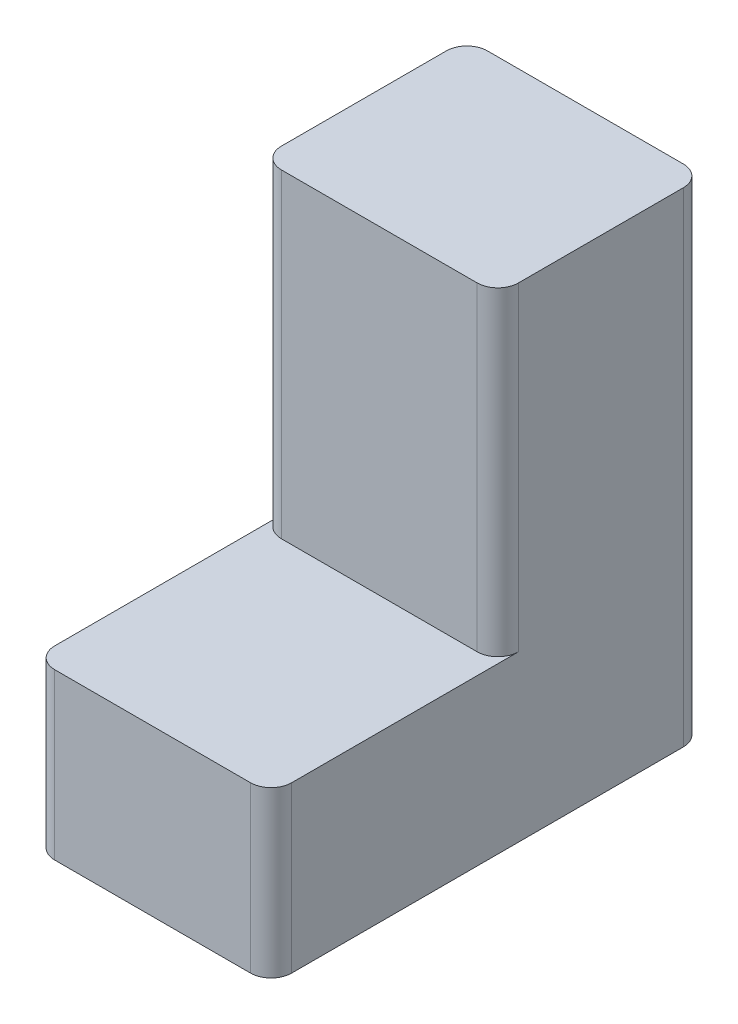
ISO-10303-21;
HEADER;
FILE_DESCRIPTION(('STEP AP214'),'2;1');
FILE_NAME('part.step','',(''),(''),'','','');
FILE_SCHEMA(('AUTOMOTIVE_DESIGN { 1 0 10303 214 1 1 1 1 }'));
ENDSEC;
DATA;
#1=APPLICATION_CONTEXT('core data for automotive mechanical design processes');
#2=APPLICATION_PROTOCOL_DEFINITION('international standard','automotive_design',2000,#1);
#3=PRODUCT_CONTEXT('',#1,'mechanical');
#4=PRODUCT('Part','Part','',(#3));
#5=PRODUCT_RELATED_PRODUCT_CATEGORY('part','',(#4));
#6=PRODUCT_DEFINITION_FORMATION('','',#4);
#7=PRODUCT_DEFINITION_CONTEXT('part definition',#1,'design');
#8=PRODUCT_DEFINITION('design','',#6,#7);
#9=PRODUCT_DEFINITION_SHAPE('','',#8);
#10=(LENGTH_UNIT() NAMED_UNIT(*) SI_UNIT(.MILLI.,.METRE.));
#11=(NAMED_UNIT(*) PLANE_ANGLE_UNIT() SI_UNIT($,.RADIAN.));
#12=(NAMED_UNIT(*) SI_UNIT($,.STERADIAN.) SOLID_ANGLE_UNIT());
#13=UNCERTAINTY_MEASURE_WITH_UNIT(LENGTH_MEASURE(1.E-05),#10,'distance_accuracy_value','');
#14=(GEOMETRIC_REPRESENTATION_CONTEXT(3) GLOBAL_UNCERTAINTY_ASSIGNED_CONTEXT((#13)) GLOBAL_UNIT_ASSIGNED_CONTEXT((#10,
#11,#12)) REPRESENTATION_CONTEXT('',''));
#15=CARTESIAN_POINT('',(0.,0.,0.));
#16=DIRECTION('',(0.,0.,1.));
#17=DIRECTION('',(1.,0.,0.));
#18=AXIS2_PLACEMENT_3D('',#15,#16,#17);
#19=CARTESIAN_POINT('',(11.5,-6.,-10.5));
#20=DIRECTION('',(0.,1.,0.));
#21=DIRECTION('',(0.,0.,1.));
#22=AXIS2_PLACEMENT_3D('',#19,#20,#21);
#23=CYLINDRICAL_SURFACE('',#22,3.5);
#24=DIRECTION('',(0.,-1.,0.));
#25=VECTOR('',#24,1.);
#26=CARTESIAN_POINT('',(9.05051025721682,0.,-13.));
#27=LINE('',#26,#25);
#28=CARTESIAN_POINT('',(9.05051025721682,0.,-13.));
#29=VERTEX_POINT('',#28);
#30=CARTESIAN_POINT('',(9.05051025721682,-6.,-13.));
#31=VERTEX_POINT('',#30);
#32=EDGE_CURVE('E146',#29,#31,#27,.T.);
#33=ORIENTED_EDGE('',*,*,#32,.T.);
#34=CARTESIAN_POINT('',(11.5,-6.,-10.5));
#35=DIRECTION('',(0.,-1.,0.));
#36=DIRECTION('',(0.,0.,-1.));
#37=AXIS2_PLACEMENT_3D('',#34,#35,#36);
#38=CIRCLE('',#37,3.5);
#39=CARTESIAN_POINT('',(9.05051025721682,-6.,-8.));
#40=VERTEX_POINT('',#39);
#41=EDGE_CURVE('E161',#40,#31,#38,.T.);
#42=ORIENTED_EDGE('',*,*,#41,.F.);
#43=DIRECTION('',(0.,-1.,0.));
#44=VECTOR('',#43,1.);
#45=CARTESIAN_POINT('',(9.05051025721682,0.,-8.));
#46=LINE('',#45,#44);
#47=CARTESIAN_POINT('',(9.05051025721682,0.,-8.));
#48=VERTEX_POINT('',#47);
#49=EDGE_CURVE('E48',#48,#40,#46,.T.);
#50=ORIENTED_EDGE('',*,*,#49,.F.);
#51=CARTESIAN_POINT('',(11.5,0.,-10.5));
#52=DIRECTION('',(0.,1.,0.));
#53=DIRECTION('',(0.,0.,1.));
#54=AXIS2_PLACEMENT_3D('',#51,#52,#53);
#55=CIRCLE('',#54,3.5);
#56=EDGE_CURVE('E167',#48,#29,#55,.F.);
#57=ORIENTED_EDGE('',*,*,#56,.T.);
#58=EDGE_LOOP('',(#33,#42,#50,#57));
#59=FACE_BOUND('',#58,.T.);
#60=ADVANCED_FACE('F33',(#59),#23,.T.);
#61=DIRECTION('',(0.,-1.,0.));
#62=VECTOR('',#61,1.);
#63=CARTESIAN_POINT('',(13.9494897427832,0.,-13.));
#64=LINE('',#63,#62);
#65=CARTESIAN_POINT('',(13.9494897427832,0.,-13.));
#66=VERTEX_POINT('',#65);
#67=CARTESIAN_POINT('',(13.9494897427832,-6.,-13.));
#68=VERTEX_POINT('',#67);
#69=EDGE_CURVE('E56',#66,#68,#64,.T.);
#70=ORIENTED_EDGE('',*,*,#69,.F.);
#71=CARTESIAN_POINT('',(13.9494897427832,0.,-8.));
#72=VERTEX_POINT('',#71);
#73=EDGE_CURVE('E158',#66,#72,#55,.F.);
#74=ORIENTED_EDGE('',*,*,#73,.T.);
#75=DIRECTION('',(0.,-1.,0.));
#76=VECTOR('',#75,1.);
#77=CARTESIAN_POINT('',(13.9494897427832,0.,-8.));
#78=LINE('',#77,#76);
#79=CARTESIAN_POINT('',(13.9494897427832,-6.,-8.));
#80=VERTEX_POINT('',#79);
#81=EDGE_CURVE('E458',#72,#80,#78,.T.);
#82=ORIENTED_EDGE('',*,*,#81,.T.);
#83=EDGE_CURVE('E160',#68,#80,#38,.T.);
#84=ORIENTED_EDGE('',*,*,#83,.F.);
#85=EDGE_LOOP('',(#70,#74,#82,#84));
#86=FACE_BOUND('',#85,.T.);
#87=ADVANCED_FACE('F156',(#86),#23,.T.);
#88=CARTESIAN_POINT('',(11.5,-6.,-10.5));
#89=DIRECTION('',(0.,-1.,0.));
#90=DIRECTION('',(0.,0.,-1.));
#91=AXIS2_PLACEMENT_3D('',#88,#89,#90);
#92=PLANE('',#91);
#93=ORIENTED_EDGE('',*,*,#41,.T.);
#94=DIRECTION('',(1.,0.,0.));
#95=VECTOR('',#94,1.);
#96=CARTESIAN_POINT('',(9.05051025721682,-6.,-13.));
#97=LINE('',#96,#95);
#98=EDGE_CURVE('E151',#31,#68,#97,.T.);
#99=ORIENTED_EDGE('',*,*,#98,.T.);
#100=ORIENTED_EDGE('',*,*,#83,.T.);
#101=DIRECTION('',(1.,0.,0.));
#102=VECTOR('',#101,1.);
#103=CARTESIAN_POINT('',(9.05051025721682,-6.,-8.));
#104=LINE('',#103,#102);
#105=EDGE_CURVE('E457',#40,#80,#104,.T.);
#106=ORIENTED_EDGE('',*,*,#105,.F.);
#107=EDGE_LOOP('',(#93,#99,#100,#106));
#108=FACE_BOUND('',#107,.T.);
#109=ADVANCED_FACE('F325',(#108),#92,.T.);
#110=CARTESIAN_POINT('',(23.,0.,-42.));
#111=DIRECTION('',(0.,1.,0.));
#112=DIRECTION('',(0.,0.,1.));
#113=AXIS2_PLACEMENT_3D('',#110,#111,#112);
#114=PLANE('',#113);
#115=ORIENTED_EDGE('',*,*,#56,.F.);
#116=DIRECTION('',(1.,0.,0.));
#117=VECTOR('',#116,1.);
#118=CARTESIAN_POINT('',(9.05051025721682,0.,-8.));
#119=LINE('',#118,#117);
#120=EDGE_CURVE('E166',#48,#72,#119,.T.);
#121=ORIENTED_EDGE('',*,*,#120,.T.);
#122=ORIENTED_EDGE('',*,*,#73,.F.);
#123=DIRECTION('',(1.,0.,0.));
#124=VECTOR('',#123,1.);
#125=CARTESIAN_POINT('',(9.05051025721682,0.,-13.));
#126=LINE('',#125,#124);
#127=EDGE_CURVE('E143',#29,#66,#126,.T.);
#128=ORIENTED_EDGE('',*,*,#127,.F.);
#129=EDGE_LOOP('',(#115,#121,#122,#128));
#130=FACE_BOUND('',#129,.T.);
#131=DIRECTION('',(0.,0.,-1.));
#132=VECTOR('',#131,1.);
#133=CARTESIAN_POINT('',(0.,0.,-42.));
#134=LINE('',#133,#132);
#135=CARTESIAN_POINT('',(0.,0.,-2.00000000000002));
#136=VERTEX_POINT('',#135);
#137=CARTESIAN_POINT('',(0.,0.,-40.));
#138=VERTEX_POINT('',#137);
#139=EDGE_CURVE('E285',#136,#138,#134,.T.);
#140=ORIENTED_EDGE('',*,*,#139,.T.);
#141=CARTESIAN_POINT('',(2.,0.,-40.));
#142=DIRECTION('',(0.,1.,0.));
#143=DIRECTION('',(0.,0.,1.));
#144=AXIS2_PLACEMENT_3D('',#141,#142,#143);
#145=CIRCLE('',#144,2.);
#146=CARTESIAN_POINT('',(2.,0.,-42.));
#147=VERTEX_POINT('',#146);
#148=EDGE_CURVE('E209',#138,#147,#145,.F.);
#149=ORIENTED_EDGE('',*,*,#148,.T.);
#150=DIRECTION('',(-1.,0.,0.));
#151=VECTOR('',#150,1.);
#152=CARTESIAN_POINT('',(23.,0.,-42.));
#153=LINE('',#152,#151);
#154=CARTESIAN_POINT('',(21.,0.,-42.));
#155=VERTEX_POINT('',#154);
#156=EDGE_CURVE('E168',#155,#147,#153,.T.);
#157=ORIENTED_EDGE('',*,*,#156,.F.);
#158=CARTESIAN_POINT('',(21.,0.,-40.));
#159=DIRECTION('',(0.,1.,0.));
#160=DIRECTION('',(0.,0.,1.));
#161=AXIS2_PLACEMENT_3D('',#158,#159,#160);
#162=CIRCLE('',#161,2.);
#163=CARTESIAN_POINT('',(23.,0.,-40.));
#164=VERTEX_POINT('',#163);
#165=EDGE_CURVE('E200',#155,#164,#162,.F.);
#166=ORIENTED_EDGE('',*,*,#165,.T.);
#167=DIRECTION('',(0.,0.,-1.));
#168=VECTOR('',#167,1.);
#169=CARTESIAN_POINT('',(23.,0.,-42.));
#170=LINE('',#169,#168);
#171=CARTESIAN_POINT('',(23.,0.,-2.00000000000002));
#172=VERTEX_POINT('',#171);
#173=EDGE_CURVE('E243',#172,#164,#170,.T.);
#174=ORIENTED_EDGE('',*,*,#173,.F.);
#175=CARTESIAN_POINT('',(21.,0.,-2.));
#176=DIRECTION('',(0.,1.,0.));
#177=DIRECTION('',(0.,0.,1.));
#178=AXIS2_PLACEMENT_3D('',#175,#176,#177);
#179=CIRCLE('',#178,2.);
#180=CARTESIAN_POINT('',(21.,0.,0.));
#181=VERTEX_POINT('',#180);
#182=EDGE_CURVE('E178',#172,#181,#179,.F.);
#183=ORIENTED_EDGE('',*,*,#182,.T.);
#184=DIRECTION('',(-1.,0.,0.));
#185=VECTOR('',#184,1.);
#186=CARTESIAN_POINT('',(23.,0.,0.));
#187=LINE('',#186,#185);
#188=CARTESIAN_POINT('',(2.,0.,0.));
#189=VERTEX_POINT('',#188);
#190=EDGE_CURVE('E259',#181,#189,#187,.T.);
#191=ORIENTED_EDGE('',*,*,#190,.T.);
#192=CARTESIAN_POINT('',(2.,0.,-2.));
#193=DIRECTION('',(0.,1.,0.));
#194=DIRECTION('',(0.,0.,1.));
#195=AXIS2_PLACEMENT_3D('',#192,#193,#194);
#196=CIRCLE('',#195,2.);
#197=EDGE_CURVE('E187',#189,#136,#196,.F.);
#198=ORIENTED_EDGE('',*,*,#197,.T.);
#199=EDGE_LOOP('',(#140,#149,#157,#166,#174,#183,#191,#198));
#200=FACE_BOUND('',#199,.T.);
#201=ADVANCED_FACE('F164',(#130,#200),#114,.F.);
#202=CARTESIAN_POINT('',(23.,47.,-42.));
#203=DIRECTION('',(0.,0.,1.));
#204=DIRECTION('',(0.,-1.,0.));
#205=AXIS2_PLACEMENT_3D('',#202,#203,#204);
#206=PLANE('',#205);
#207=ORIENTED_EDGE('',*,*,#156,.T.);
#208=DIRECTION('',(0.,1.,0.));
#209=VECTOR('',#208,1.);
#210=CARTESIAN_POINT('',(2.,47.,-42.));
#211=LINE('',#210,#209);
#212=CARTESIAN_POINT('',(2.,47.,-42.));
#213=VERTEX_POINT('',#212);
#214=EDGE_CURVE('E202',#147,#213,#211,.T.);
#215=ORIENTED_EDGE('',*,*,#214,.T.);
#216=DIRECTION('',(-1.,0.,0.));
#217=VECTOR('',#216,1.);
#218=CARTESIAN_POINT('',(23.,47.,-42.));
#219=LINE('',#218,#217);
#220=CARTESIAN_POINT('',(21.,47.,-42.));
#221=VERTEX_POINT('',#220);
#222=EDGE_CURVE('E172',#221,#213,#219,.T.);
#223=ORIENTED_EDGE('',*,*,#222,.F.);
#224=DIRECTION('',(0.,1.,0.));
#225=VECTOR('',#224,1.);
#226=CARTESIAN_POINT('',(21.,47.,-42.));
#227=LINE('',#226,#225);
#228=EDGE_CURVE('E198',#221,#155,#227,.F.);
#229=ORIENTED_EDGE('',*,*,#228,.T.);
#230=EDGE_LOOP('',(#207,#215,#223,#229));
#231=FACE_BOUND('',#230,.T.);
#232=ADVANCED_FACE('F268',(#231),#206,.F.);
#233=CARTESIAN_POINT('',(23.,47.,-22.));
#234=DIRECTION('',(0.,-1.,0.));
#235=DIRECTION('',(0.,0.,-1.));
#236=AXIS2_PLACEMENT_3D('',#233,#234,#235);
#237=PLANE('',#236);
#238=DIRECTION('',(-1.,0.,0.));
#239=VECTOR('',#238,1.);
#240=CARTESIAN_POINT('',(23.,47.,-22.));
#241=LINE('',#240,#239);
#242=CARTESIAN_POINT('',(21.,47.,-22.));
#243=VERTEX_POINT('',#242);
#244=CARTESIAN_POINT('',(2.,47.,-22.));
#245=VERTEX_POINT('',#244);
#246=EDGE_CURVE('E233',#243,#245,#241,.T.);
#247=ORIENTED_EDGE('',*,*,#246,.F.);
#248=CARTESIAN_POINT('',(21.,47.,-24.));
#249=DIRECTION('',(0.,-1.,0.));
#250=DIRECTION('',(0.,0.,-1.));
#251=AXIS2_PLACEMENT_3D('',#248,#249,#250);
#252=CIRCLE('',#251,2.);
#253=CARTESIAN_POINT('',(23.,47.,-24.));
#254=VERTEX_POINT('',#253);
#255=EDGE_CURVE('E41',#243,#254,#252,.F.);
#256=ORIENTED_EDGE('',*,*,#255,.T.);
#257=DIRECTION('',(0.,0.,1.));
#258=VECTOR('',#257,1.);
#259=CARTESIAN_POINT('',(23.,47.,-22.));
#260=LINE('',#259,#258);
#261=CARTESIAN_POINT('',(23.,47.,-40.));
#262=VERTEX_POINT('',#261);
#263=EDGE_CURVE('E232',#262,#254,#260,.T.);
#264=ORIENTED_EDGE('',*,*,#263,.F.);
#265=CARTESIAN_POINT('',(21.,47.,-40.));
#266=DIRECTION('',(0.,-1.,0.));
#267=DIRECTION('',(0.,0.,-1.));
#268=AXIS2_PLACEMENT_3D('',#265,#266,#267);
#269=CIRCLE('',#268,2.);
#270=EDGE_CURVE('E196',#262,#221,#269,.F.);
#271=ORIENTED_EDGE('',*,*,#270,.T.);
#272=ORIENTED_EDGE('',*,*,#222,.T.);
#273=CARTESIAN_POINT('',(2.,47.,-40.));
#274=DIRECTION('',(0.,-1.,0.));
#275=DIRECTION('',(0.,0.,-1.));
#276=AXIS2_PLACEMENT_3D('',#273,#274,#275);
#277=CIRCLE('',#276,2.);
#278=CARTESIAN_POINT('',(0.,47.,-40.));
#279=VERTEX_POINT('',#278);
#280=EDGE_CURVE('E205',#213,#279,#277,.F.);
#281=ORIENTED_EDGE('',*,*,#280,.T.);
#282=DIRECTION('',(0.,0.,1.));
#283=VECTOR('',#282,1.);
#284=CARTESIAN_POINT('',(0.,47.,-22.));
#285=LINE('',#284,#283);
#286=CARTESIAN_POINT('',(0.,47.,-24.));
#287=VERTEX_POINT('',#286);
#288=EDGE_CURVE('E279',#279,#287,#285,.T.);
#289=ORIENTED_EDGE('',*,*,#288,.T.);
#290=CARTESIAN_POINT('',(2.,47.,-24.));
#291=DIRECTION('',(0.,-1.,0.));
#292=DIRECTION('',(0.,0.,-1.));
#293=AXIS2_PLACEMENT_3D('',#290,#291,#292);
#294=CIRCLE('',#293,2.);
#295=EDGE_CURVE('E216',#287,#245,#294,.F.);
#296=ORIENTED_EDGE('',*,*,#295,.T.);
#297=EDGE_LOOP('',(#247,#256,#264,#271,#272,#281,#289,#296));
#298=FACE_BOUND('',#297,.T.);
#299=ADVANCED_FACE('F231',(#298),#237,.F.);
#300=CARTESIAN_POINT('',(23.,16.,-22.));
#301=DIRECTION('',(0.,0.,-1.));
#302=DIRECTION('',(-1.,0.,0.));
#303=AXIS2_PLACEMENT_3D('',#300,#301,#302);
#304=PLANE('',#303);
#305=DIRECTION('',(-1.,0.,0.));
#306=VECTOR('',#305,1.);
#307=CARTESIAN_POINT('',(23.,16.,-22.));
#308=LINE('',#307,#306);
#309=CARTESIAN_POINT('',(21.,16.,-22.));
#310=VERTEX_POINT('',#309);
#311=CARTESIAN_POINT('',(2.,16.,-22.));
#312=VERTEX_POINT('',#311);
#313=EDGE_CURVE('E250',#310,#312,#308,.T.);
#314=ORIENTED_EDGE('',*,*,#313,.F.);
#315=DIRECTION('',(0.,-1.,0.));
#316=VECTOR('',#315,1.);
#317=CARTESIAN_POINT('',(21.,16.,-22.));
#318=LINE('',#317,#316);
#319=EDGE_CURVE('E225',#310,#243,#318,.F.);
#320=ORIENTED_EDGE('',*,*,#319,.T.);
#321=ORIENTED_EDGE('',*,*,#246,.T.);
#322=DIRECTION('',(0.,-1.,0.));
#323=VECTOR('',#322,1.);
#324=CARTESIAN_POINT('',(2.,16.,-22.));
#325=LINE('',#324,#323);
#326=EDGE_CURVE('E211',#245,#312,#325,.T.);
#327=ORIENTED_EDGE('',*,*,#326,.T.);
#328=EDGE_LOOP('',(#314,#320,#321,#327));
#329=FACE_BOUND('',#328,.T.);
#330=ADVANCED_FACE('F253',(#329),#304,.F.);
#331=CARTESIAN_POINT('',(23.,16.,0.));
#332=DIRECTION('',(0.,-1.,0.));
#333=DIRECTION('',(0.,0.,-1.));
#334=AXIS2_PLACEMENT_3D('',#331,#332,#333);
#335=PLANE('',#334);
#336=DIRECTION('',(0.,0.,1.));
#337=VECTOR('',#336,1.);
#338=CARTESIAN_POINT('',(0.,16.,0.));
#339=LINE('',#338,#337);
#340=CARTESIAN_POINT('',(0.,16.,-24.));
#341=VERTEX_POINT('',#340);
#342=CARTESIAN_POINT('',(0.,16.,-2.));
#343=VERTEX_POINT('',#342);
#344=EDGE_CURVE('E277',#341,#343,#339,.T.);
#345=ORIENTED_EDGE('',*,*,#344,.T.);
#346=CARTESIAN_POINT('',(2.,16.,-2.));
#347=DIRECTION('',(0.,-1.,0.));
#348=DIRECTION('',(0.,0.,-1.));
#349=AXIS2_PLACEMENT_3D('',#346,#347,#348);
#350=CIRCLE('',#349,2.);
#351=CARTESIAN_POINT('',(2.,16.,0.));
#352=VERTEX_POINT('',#351);
#353=EDGE_CURVE('E191',#343,#352,#350,.F.);
#354=ORIENTED_EDGE('',*,*,#353,.T.);
#355=DIRECTION('',(-1.,0.,0.));
#356=VECTOR('',#355,1.);
#357=CARTESIAN_POINT('',(23.,16.,0.));
#358=LINE('',#357,#356);
#359=CARTESIAN_POINT('',(21.,16.,0.));
#360=VERTEX_POINT('',#359);
#361=EDGE_CURVE('E255',#360,#352,#358,.T.);
#362=ORIENTED_EDGE('',*,*,#361,.F.);
#363=CARTESIAN_POINT('',(21.,16.,-2.));
#364=DIRECTION('',(0.,-1.,0.));
#365=DIRECTION('',(0.,0.,-1.));
#366=AXIS2_PLACEMENT_3D('',#363,#364,#365);
#367=CIRCLE('',#366,2.);
#368=CARTESIAN_POINT('',(23.,16.,-2.));
#369=VERTEX_POINT('',#368);
#370=EDGE_CURVE('E182',#360,#369,#367,.F.);
#371=ORIENTED_EDGE('',*,*,#370,.T.);
#372=DIRECTION('',(0.,0.,1.));
#373=VECTOR('',#372,1.);
#374=CARTESIAN_POINT('',(23.,16.,0.));
#375=LINE('',#374,#373);
#376=CARTESIAN_POINT('',(23.,16.,-24.));
#377=VERTEX_POINT('',#376);
#378=EDGE_CURVE('E242',#377,#369,#375,.T.);
#379=ORIENTED_EDGE('',*,*,#378,.F.);
#380=CARTESIAN_POINT('',(21.,16.,-24.));
#381=DIRECTION('',(0.,-1.,0.));
#382=DIRECTION('',(0.,0.,-1.));
#383=AXIS2_PLACEMENT_3D('',#380,#381,#382);
#384=CIRCLE('',#383,2.);
#385=EDGE_CURVE('E11',#377,#310,#384,.T.);
#386=ORIENTED_EDGE('',*,*,#385,.T.);
#387=ORIENTED_EDGE('',*,*,#313,.T.);
#388=CARTESIAN_POINT('',(2.,16.,-24.));
#389=DIRECTION('',(0.,-1.,0.));
#390=DIRECTION('',(0.,0.,-1.));
#391=AXIS2_PLACEMENT_3D('',#388,#389,#390);
#392=CIRCLE('',#391,2.);
#393=EDGE_CURVE('E219',#312,#341,#392,.T.);
#394=ORIENTED_EDGE('',*,*,#393,.T.);
#395=EDGE_LOOP('',(#345,#354,#362,#371,#379,#386,#387,#394));
#396=FACE_BOUND('',#395,.T.);
#397=ADVANCED_FACE('F249',(#396),#335,.F.);
#398=CARTESIAN_POINT('',(23.,0.,0.));
#399=DIRECTION('',(0.,0.,-1.));
#400=DIRECTION('',(-1.,0.,0.));
#401=AXIS2_PLACEMENT_3D('',#398,#399,#400);
#402=PLANE('',#401);
#403=ORIENTED_EDGE('',*,*,#361,.T.);
#404=DIRECTION('',(0.,-1.,0.));
#405=VECTOR('',#404,1.);
#406=CARTESIAN_POINT('',(2.,0.,0.));
#407=LINE('',#406,#405);
#408=EDGE_CURVE('E184',#352,#189,#407,.T.);
#409=ORIENTED_EDGE('',*,*,#408,.T.);
#410=ORIENTED_EDGE('',*,*,#190,.F.);
#411=DIRECTION('',(0.,-1.,0.));
#412=VECTOR('',#411,1.);
#413=CARTESIAN_POINT('',(21.,0.,0.));
#414=LINE('',#413,#412);
#415=EDGE_CURVE('E180',#181,#360,#414,.F.);
#416=ORIENTED_EDGE('',*,*,#415,.T.);
#417=EDGE_LOOP('',(#403,#409,#410,#416));
#418=FACE_BOUND('',#417,.T.);
#419=ADVANCED_FACE('F292',(#418),#402,.F.);
#420=CARTESIAN_POINT('',(23.,0.,0.));
#421=DIRECTION('',(-1.,0.,0.));
#422=DIRECTION('',(0.,0.,1.));
#423=AXIS2_PLACEMENT_3D('',#420,#421,#422);
#424=PLANE('',#423);
#425=ORIENTED_EDGE('',*,*,#263,.T.);
#426=DIRECTION('',(0.,-1.,0.));
#427=VECTOR('',#426,1.);
#428=CARTESIAN_POINT('',(23.,0.,-24.));
#429=LINE('',#428,#427);
#430=EDGE_CURVE('E222',#254,#377,#429,.T.);
#431=ORIENTED_EDGE('',*,*,#430,.T.);
#432=ORIENTED_EDGE('',*,*,#378,.T.);
#433=DIRECTION('',(0.,-1.,0.));
#434=VECTOR('',#433,1.);
#435=CARTESIAN_POINT('',(23.,0.,-2.));
#436=LINE('',#435,#434);
#437=EDGE_CURVE('E170',#369,#172,#436,.T.);
#438=ORIENTED_EDGE('',*,*,#437,.T.);
#439=ORIENTED_EDGE('',*,*,#173,.T.);
#440=DIRECTION('',(0.,1.,0.));
#441=VECTOR('',#440,1.);
#442=CARTESIAN_POINT('',(23.,0.,-40.));
#443=LINE('',#442,#441);
#444=EDGE_CURVE('E193',#164,#262,#443,.T.);
#445=ORIENTED_EDGE('',*,*,#444,.T.);
#446=EDGE_LOOP('',(#425,#431,#432,#438,#439,#445));
#447=FACE_BOUND('',#446,.T.);
#448=ADVANCED_FACE('F238',(#447),#424,.F.);
#449=CARTESIAN_POINT('',(0.,0.,0.));
#450=DIRECTION('',(-1.,0.,0.));
#451=DIRECTION('',(0.,0.,1.));
#452=AXIS2_PLACEMENT_3D('',#449,#450,#451);
#453=PLANE('',#452);
#454=ORIENTED_EDGE('',*,*,#344,.F.);
#455=DIRECTION('',(0.,-1.,0.));
#456=VECTOR('',#455,1.);
#457=CARTESIAN_POINT('',(0.,47.,-24.));
#458=LINE('',#457,#456);
#459=EDGE_CURVE('E214',#341,#287,#458,.F.);
#460=ORIENTED_EDGE('',*,*,#459,.T.);
#461=ORIENTED_EDGE('',*,*,#288,.F.);
#462=DIRECTION('',(0.,1.,0.));
#463=VECTOR('',#462,1.);
#464=CARTESIAN_POINT('',(0.,0.,-40.));
#465=LINE('',#464,#463);
#466=EDGE_CURVE('E207',#279,#138,#465,.F.);
#467=ORIENTED_EDGE('',*,*,#466,.T.);
#468=ORIENTED_EDGE('',*,*,#139,.F.);
#469=DIRECTION('',(0.,-1.,0.));
#470=VECTOR('',#469,1.);
#471=CARTESIAN_POINT('',(0.,16.,-2.));
#472=LINE('',#471,#470);
#473=EDGE_CURVE('E189',#136,#343,#472,.F.);
#474=ORIENTED_EDGE('',*,*,#473,.T.);
#475=EDGE_LOOP('',(#454,#460,#461,#467,#468,#474));
#476=FACE_BOUND('',#475,.T.);
#477=ADVANCED_FACE('F303',(#476),#453,.T.);
#478=CARTESIAN_POINT('',(21.,0.,-2.));
#479=DIRECTION('',(0.,-1.,0.));
#480=DIRECTION('',(0.,0.,-1.));
#481=AXIS2_PLACEMENT_3D('',#478,#479,#480);
#482=CYLINDRICAL_SURFACE('',#481,2.);
#483=ORIENTED_EDGE('',*,*,#370,.F.);
#484=ORIENTED_EDGE('',*,*,#415,.F.);
#485=ORIENTED_EDGE('',*,*,#182,.F.);
#486=ORIENTED_EDGE('',*,*,#437,.F.);
#487=EDGE_LOOP('',(#483,#484,#485,#486));
#488=FACE_BOUND('',#487,.T.);
#489=ADVANCED_FACE('F297',(#488),#482,.T.);
#490=CARTESIAN_POINT('',(2.,0.,-2.));
#491=DIRECTION('',(0.,1.,0.));
#492=DIRECTION('',(0.,0.,1.));
#493=AXIS2_PLACEMENT_3D('',#490,#491,#492);
#494=CYLINDRICAL_SURFACE('',#493,2.);
#495=ORIENTED_EDGE('',*,*,#353,.F.);
#496=ORIENTED_EDGE('',*,*,#473,.F.);
#497=ORIENTED_EDGE('',*,*,#197,.F.);
#498=ORIENTED_EDGE('',*,*,#408,.F.);
#499=EDGE_LOOP('',(#495,#496,#497,#498));
#500=FACE_BOUND('',#499,.T.);
#501=ADVANCED_FACE('F300',(#500),#494,.T.);
#502=CARTESIAN_POINT('',(21.,0.,-40.));
#503=DIRECTION('',(0.,1.,0.));
#504=DIRECTION('',(0.,0.,1.));
#505=AXIS2_PLACEMENT_3D('',#502,#503,#504);
#506=CYLINDRICAL_SURFACE('',#505,2.);
#507=ORIENTED_EDGE('',*,*,#165,.F.);
#508=ORIENTED_EDGE('',*,*,#228,.F.);
#509=ORIENTED_EDGE('',*,*,#270,.F.);
#510=ORIENTED_EDGE('',*,*,#444,.F.);
#511=EDGE_LOOP('',(#507,#508,#509,#510));
#512=FACE_BOUND('',#511,.T.);
#513=ADVANCED_FACE('F273',(#512),#506,.T.);
#514=CARTESIAN_POINT('',(2.,47.,-40.));
#515=DIRECTION('',(0.,-1.,0.));
#516=DIRECTION('',(0.,0.,-1.));
#517=AXIS2_PLACEMENT_3D('',#514,#515,#516);
#518=CYLINDRICAL_SURFACE('',#517,2.);
#519=ORIENTED_EDGE('',*,*,#148,.F.);
#520=ORIENTED_EDGE('',*,*,#466,.F.);
#521=ORIENTED_EDGE('',*,*,#280,.F.);
#522=ORIENTED_EDGE('',*,*,#214,.F.);
#523=EDGE_LOOP('',(#519,#520,#521,#522));
#524=FACE_BOUND('',#523,.T.);
#525=ADVANCED_FACE('F311',(#524),#518,.T.);
#526=CARTESIAN_POINT('',(2.,16.,-24.));
#527=DIRECTION('',(0.,1.,0.));
#528=DIRECTION('',(0.,0.,1.));
#529=AXIS2_PLACEMENT_3D('',#526,#527,#528);
#530=CYLINDRICAL_SURFACE('',#529,2.);
#531=ORIENTED_EDGE('',*,*,#295,.F.);
#532=ORIENTED_EDGE('',*,*,#459,.F.);
#533=ORIENTED_EDGE('',*,*,#393,.F.);
#534=ORIENTED_EDGE('',*,*,#326,.F.);
#535=EDGE_LOOP('',(#531,#532,#533,#534));
#536=FACE_BOUND('',#535,.T.);
#537=ADVANCED_FACE('F307',(#536),#530,.T.);
#538=CARTESIAN_POINT('',(21.,0.,-24.));
#539=DIRECTION('',(0.,-1.,0.));
#540=DIRECTION('',(0.,0.,-1.));
#541=AXIS2_PLACEMENT_3D('',#538,#539,#540);
#542=CYLINDRICAL_SURFACE('',#541,2.);
#543=ORIENTED_EDGE('',*,*,#255,.F.);
#544=ORIENTED_EDGE('',*,*,#319,.F.);
#545=ORIENTED_EDGE('',*,*,#385,.F.);
#546=ORIENTED_EDGE('',*,*,#430,.F.);
#547=EDGE_LOOP('',(#543,#544,#545,#546));
#548=FACE_BOUND('',#547,.T.);
#549=ADVANCED_FACE('F35',(#548),#542,.T.);
#550=CARTESIAN_POINT('',(9.05051025721682,0.,-8.));
#551=DIRECTION('',(0.,0.,-1.));
#552=DIRECTION('',(0.,1.,0.));
#553=AXIS2_PLACEMENT_3D('',#550,#551,#552);
#554=PLANE('',#553);
#555=ORIENTED_EDGE('',*,*,#105,.T.);
#556=ORIENTED_EDGE('',*,*,#81,.F.);
#557=ORIENTED_EDGE('',*,*,#120,.F.);
#558=ORIENTED_EDGE('',*,*,#49,.T.);
#559=EDGE_LOOP('',(#555,#556,#557,#558));
#560=FACE_BOUND('',#559,.T.);
#561=ADVANCED_FACE('F414',(#560),#554,.F.);
#562=CARTESIAN_POINT('',(9.05051025721682,0.,-13.));
#563=DIRECTION('',(0.,0.,-1.));
#564=DIRECTION('',(0.,1.,0.));
#565=AXIS2_PLACEMENT_3D('',#562,#563,#564);
#566=PLANE('',#565);
#567=ORIENTED_EDGE('',*,*,#98,.F.);
#568=ORIENTED_EDGE('',*,*,#32,.F.);
#569=ORIENTED_EDGE('',*,*,#127,.T.);
#570=ORIENTED_EDGE('',*,*,#69,.T.);
#571=EDGE_LOOP('',(#567,#568,#569,#570));
#572=FACE_BOUND('',#571,.T.);
#573=ADVANCED_FACE('F144',(#572),#566,.T.);
#574=CLOSED_SHELL('',(#60,#87,#109,#201,#232,#299,#330,#397,#419,#448,#477,#489,#501,#513,#525,
#537,#549,#561,#573));
#575=MANIFOLD_SOLID_BREP('B2',#574);
#576=ADVANCED_BREP_SHAPE_REPRESENTATION('',(#18,#575),#14);
#577=SHAPE_DEFINITION_REPRESENTATION(#9,#576);
ENDSEC;
END-ISO-10303-21;
